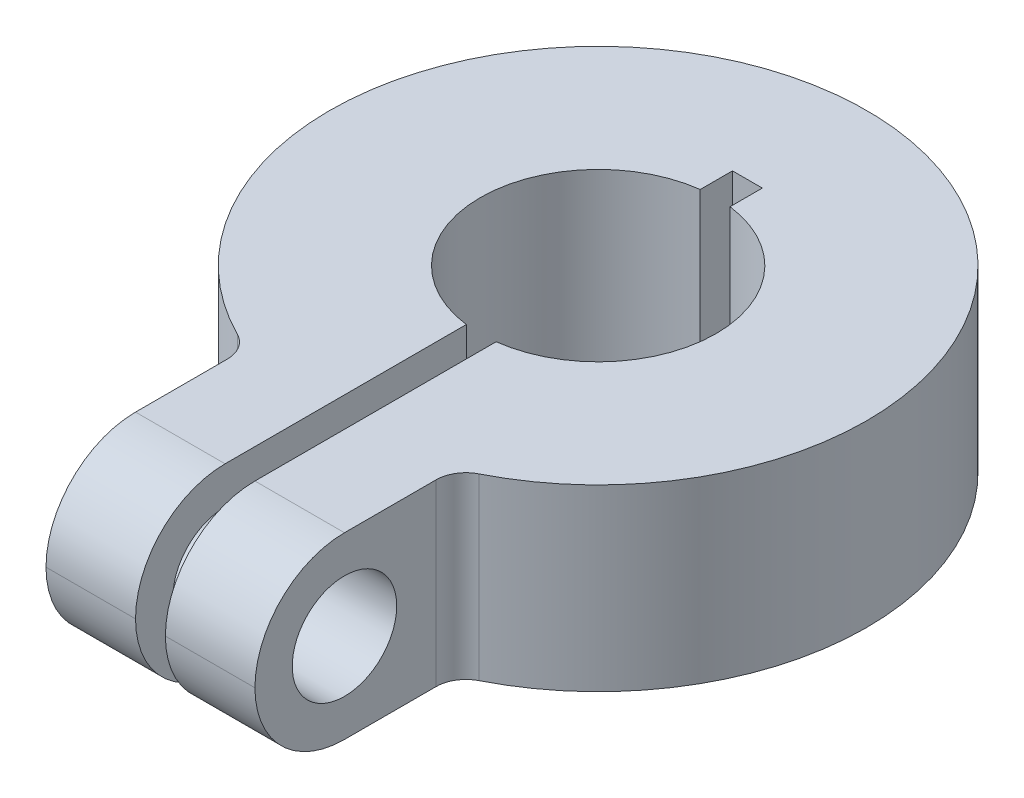
ISO-10303-21;
HEADER;
FILE_DESCRIPTION(('STEP AP214'),'2;1');
FILE_NAME('part.step','',(''),(''),'','','');
FILE_SCHEMA(('AUTOMOTIVE_DESIGN { 1 0 10303 214 1 1 1 1 }'));
ENDSEC;
DATA;
#1=APPLICATION_CONTEXT('core data for automotive mechanical design processes');
#2=APPLICATION_PROTOCOL_DEFINITION('international standard','automotive_design',2000,#1);
#3=PRODUCT_CONTEXT('',#1,'mechanical');
#4=PRODUCT('Part','Part','',(#3));
#5=PRODUCT_RELATED_PRODUCT_CATEGORY('part','',(#4));
#6=PRODUCT_DEFINITION_FORMATION('','',#4);
#7=PRODUCT_DEFINITION_CONTEXT('part definition',#1,'design');
#8=PRODUCT_DEFINITION('design','',#6,#7);
#9=PRODUCT_DEFINITION_SHAPE('','',#8);
#10=(LENGTH_UNIT() NAMED_UNIT(*) SI_UNIT(.MILLI.,.METRE.));
#11=(NAMED_UNIT(*) PLANE_ANGLE_UNIT() SI_UNIT($,.RADIAN.));
#12=(NAMED_UNIT(*) SI_UNIT($,.STERADIAN.) SOLID_ANGLE_UNIT());
#13=UNCERTAINTY_MEASURE_WITH_UNIT(LENGTH_MEASURE(1.E-05),#10,'distance_accuracy_value','');
#14=(GEOMETRIC_REPRESENTATION_CONTEXT(3) GLOBAL_UNCERTAINTY_ASSIGNED_CONTEXT((#13)) GLOBAL_UNIT_ASSIGNED_CONTEXT((#10,
#11,#12)) REPRESENTATION_CONTEXT('',''));
#15=CARTESIAN_POINT('',(0.,0.,0.));
#16=DIRECTION('',(0.,0.,1.));
#17=DIRECTION('',(1.,0.,0.));
#18=AXIS2_PLACEMENT_3D('',#15,#16,#17);
#19=CARTESIAN_POINT('',(0.,6.,0.));
#20=DIRECTION('',(0.,-1.,0.));
#21=DIRECTION('',(0.,0.,-1.));
#22=AXIS2_PLACEMENT_3D('',#19,#20,#21);
#23=CYLINDRICAL_SURFACE('',#22,3.95);
#24=DIRECTION('',(0.,-1.,0.));
#25=VECTOR('',#24,1.);
#26=CARTESIAN_POINT('',(0.500000000000001,6.,3.91822663969301));
#27=LINE('',#26,#25);
#28=CARTESIAN_POINT('',(0.500000000000001,6.,3.91822663969301));
#29=VERTEX_POINT('',#28);
#30=CARTESIAN_POINT('',(0.500000000000001,0.,3.91822663969301));
#31=VERTEX_POINT('',#30);
#32=EDGE_CURVE('E271',#29,#31,#27,.T.);
#33=ORIENTED_EDGE('',*,*,#32,.F.);
#34=CARTESIAN_POINT('',(0.,6.,0.));
#35=DIRECTION('',(0.,1.,0.));
#36=DIRECTION('',(0.,0.,1.));
#37=AXIS2_PLACEMENT_3D('',#34,#35,#36);
#38=CIRCLE('',#37,3.95);
#39=CARTESIAN_POINT('',(0.500000000000001,6.,-3.91822663969301));
#40=VERTEX_POINT('',#39);
#41=EDGE_CURVE('E262',#29,#40,#38,.T.);
#42=ORIENTED_EDGE('',*,*,#41,.T.);
#43=DIRECTION('',(0.,-1.,0.));
#44=VECTOR('',#43,1.);
#45=CARTESIAN_POINT('',(0.500000000000001,6.,-3.91822663969301));
#46=LINE('',#45,#44);
#47=CARTESIAN_POINT('',(0.500000000000001,0.,-3.91822663969301));
#48=VERTEX_POINT('',#47);
#49=EDGE_CURVE('E274',#48,#40,#46,.F.);
#50=ORIENTED_EDGE('',*,*,#49,.F.);
#51=CARTESIAN_POINT('',(0.,0.,0.));
#52=DIRECTION('',(0.,1.,0.));
#53=DIRECTION('',(0.,0.,1.));
#54=AXIS2_PLACEMENT_3D('',#51,#52,#53);
#55=CIRCLE('',#54,3.95);
#56=EDGE_CURVE('E171',#31,#48,#55,.T.);
#57=ORIENTED_EDGE('',*,*,#56,.F.);
#58=EDGE_LOOP('',(#33,#42,#50,#57));
#59=FACE_BOUND('',#58,.T.);
#60=ADVANCED_FACE('F34',(#59),#23,.F.);
#61=CARTESIAN_POINT('',(0.,6.,0.));
#62=DIRECTION('',(0.,-1.,0.));
#63=DIRECTION('',(0.,0.,-1.));
#64=AXIS2_PLACEMENT_3D('',#61,#62,#63);
#65=CYLINDRICAL_SURFACE('',#64,9.);
#66=CARTESIAN_POINT('',(0.,0.,0.));
#67=DIRECTION('',(0.,1.,0.));
#68=DIRECTION('',(0.,0.,1.));
#69=AXIS2_PLACEMENT_3D('',#66,#67,#68);
#70=CIRCLE('',#69,9.);
#71=CARTESIAN_POINT('',(4.05,0.,8.03725699477129));
#72=VERTEX_POINT('',#71);
#73=CARTESIAN_POINT('',(-4.05,0.,8.03725699477129));
#74=VERTEX_POINT('',#73);
#75=EDGE_CURVE('E250',#72,#74,#70,.T.);
#76=ORIENTED_EDGE('',*,*,#75,.T.);
#77=DIRECTION('',(0.,-1.,0.));
#78=VECTOR('',#77,1.);
#79=CARTESIAN_POINT('',(-4.05,6.,8.03725699477129));
#80=LINE('',#79,#78);
#81=CARTESIAN_POINT('',(-4.05,6.,8.03725699477129));
#82=VERTEX_POINT('',#81);
#83=EDGE_CURVE('E224',#74,#82,#80,.F.);
#84=ORIENTED_EDGE('',*,*,#83,.T.);
#85=CARTESIAN_POINT('',(0.,6.,0.));
#86=DIRECTION('',(0.,1.,0.));
#87=DIRECTION('',(0.,0.,1.));
#88=AXIS2_PLACEMENT_3D('',#85,#86,#87);
#89=CIRCLE('',#88,9.);
#90=CARTESIAN_POINT('',(4.05,6.,8.03725699477129));
#91=VERTEX_POINT('',#90);
#92=EDGE_CURVE('E238',#91,#82,#89,.T.);
#93=ORIENTED_EDGE('',*,*,#92,.F.);
#94=DIRECTION('',(0.,-1.,0.));
#95=VECTOR('',#94,1.);
#96=CARTESIAN_POINT('',(4.05,6.,8.03725699477129));
#97=LINE('',#96,#95);
#98=EDGE_CURVE('E221',#91,#72,#97,.T.);
#99=ORIENTED_EDGE('',*,*,#98,.T.);
#100=EDGE_LOOP('',(#76,#84,#93,#99));
#101=FACE_BOUND('',#100,.T.);
#102=ADVANCED_FACE('F253',(#101),#65,.T.);
#103=CARTESIAN_POINT('',(-3.5,6.,0.));
#104=DIRECTION('',(-1.,0.,0.));
#105=DIRECTION('',(0.,0.,1.));
#106=AXIS2_PLACEMENT_3D('',#103,#104,#105);
#107=PLANE('',#106);
#108=CARTESIAN_POINT('',(-3.5,3.,12.));
#109=DIRECTION('',(-1.,0.,0.));
#110=DIRECTION('',(0.,0.,1.));
#111=AXIS2_PLACEMENT_3D('',#108,#109,#110);
#112=CIRCLE('',#111,1.75);
#113=CARTESIAN_POINT('',(-3.5,3.,13.75));
#114=VERTEX_POINT('',#113);
#115=EDGE_CURVE('E213',#114,#114,#112,.T.);
#116=ORIENTED_EDGE('',*,*,#115,.F.);
#117=EDGE_LOOP('',(#116));
#118=FACE_BOUND('',#117,.T.);
#119=DIRECTION('',(0.,0.,-1.));
#120=VECTOR('',#119,1.);
#121=CARTESIAN_POINT('',(-3.5,6.,0.));
#122=LINE('',#121,#120);
#123=CARTESIAN_POINT('',(-3.5,6.,12.));
#124=VERTEX_POINT('',#123);
#125=CARTESIAN_POINT('',(-3.5,6.,8.93028554974588));
#126=VERTEX_POINT('',#125);
#127=EDGE_CURVE('E177',#124,#126,#122,.T.);
#128=ORIENTED_EDGE('',*,*,#127,.T.);
#129=DIRECTION('',(0.,-1.,0.));
#130=VECTOR('',#129,1.);
#131=CARTESIAN_POINT('',(-3.5,6.,8.93028554974588));
#132=LINE('',#131,#130);
#133=CARTESIAN_POINT('',(-3.5,0.,8.93028554974588));
#134=VERTEX_POINT('',#133);
#135=EDGE_CURVE('E206',#126,#134,#132,.T.);
#136=ORIENTED_EDGE('',*,*,#135,.T.);
#137=DIRECTION('',(0.,0.,-1.));
#138=VECTOR('',#137,1.);
#139=CARTESIAN_POINT('',(-3.5,0.,0.));
#140=LINE('',#139,#138);
#141=CARTESIAN_POINT('',(-3.5,0.,12.));
#142=VERTEX_POINT('',#141);
#143=EDGE_CURVE('E251',#142,#134,#140,.T.);
#144=ORIENTED_EDGE('',*,*,#143,.F.);
#145=CARTESIAN_POINT('',(-3.5,3.,12.));
#146=DIRECTION('',(-1.,0.,0.));
#147=DIRECTION('',(0.,0.,1.));
#148=AXIS2_PLACEMENT_3D('',#145,#146,#147);
#149=CIRCLE('',#148,3.);
#150=CARTESIAN_POINT('',(-3.5,3.,15.));
#151=VERTEX_POINT('',#150);
#152=EDGE_CURVE('E192',#142,#151,#149,.T.);
#153=ORIENTED_EDGE('',*,*,#152,.T.);
#154=CARTESIAN_POINT('',(-3.5,3.,12.));
#155=DIRECTION('',(-1.,0.,0.));
#156=DIRECTION('',(0.,0.,1.));
#157=AXIS2_PLACEMENT_3D('',#154,#155,#156);
#158=CIRCLE('',#157,3.);
#159=EDGE_CURVE('E190',#151,#124,#158,.T.);
#160=ORIENTED_EDGE('',*,*,#159,.T.);
#161=EDGE_LOOP('',(#128,#136,#144,#153,#160));
#162=FACE_BOUND('',#161,.T.);
#163=ADVANCED_FACE('F243',(#118,#162),#107,.T.);
#164=DIRECTION('',(0.,-1.,0.));
#165=VECTOR('',#164,1.);
#166=CARTESIAN_POINT('',(-0.499999999999999,6.,-3.91822663969301));
#167=LINE('',#166,#165);
#168=CARTESIAN_POINT('',(-0.499999999999999,6.,-3.91822663969301));
#169=VERTEX_POINT('',#168);
#170=CARTESIAN_POINT('',(-0.499999999999999,0.,-3.91822663969301));
#171=VERTEX_POINT('',#170);
#172=EDGE_CURVE('E276',#169,#171,#167,.T.);
#173=ORIENTED_EDGE('',*,*,#172,.F.);
#174=CARTESIAN_POINT('',(-0.499999999999999,6.,3.91822663969301));
#175=VERTEX_POINT('',#174);
#176=EDGE_CURVE('E260',#169,#175,#38,.T.);
#177=ORIENTED_EDGE('',*,*,#176,.T.);
#178=DIRECTION('',(0.,-1.,0.));
#179=VECTOR('',#178,1.);
#180=CARTESIAN_POINT('',(-0.499999999999999,6.,3.91822663969301));
#181=LINE('',#180,#179);
#182=CARTESIAN_POINT('',(-0.499999999999999,0.,3.91822663969301));
#183=VERTEX_POINT('',#182);
#184=EDGE_CURVE('E278',#183,#175,#181,.F.);
#185=ORIENTED_EDGE('',*,*,#184,.F.);
#186=EDGE_CURVE('E258',#171,#183,#55,.T.);
#187=ORIENTED_EDGE('',*,*,#186,.F.);
#188=EDGE_LOOP('',(#173,#177,#185,#187));
#189=FACE_BOUND('',#188,.T.);
#190=ADVANCED_FACE('F302',(#189),#23,.F.);
#191=CARTESIAN_POINT('',(3.5,6.,0.));
#192=DIRECTION('',(-1.,0.,0.));
#193=DIRECTION('',(0.,0.,1.));
#194=AXIS2_PLACEMENT_3D('',#191,#192,#193);
#195=PLANE('',#194);
#196=CARTESIAN_POINT('',(3.5,3.,12.));
#197=DIRECTION('',(1.,0.,0.));
#198=DIRECTION('',(0.,0.,-1.));
#199=AXIS2_PLACEMENT_3D('',#196,#197,#198);
#200=CIRCLE('',#199,1.75);
#201=CARTESIAN_POINT('',(3.5,3.,10.25));
#202=VERTEX_POINT('',#201);
#203=EDGE_CURVE('E218',#202,#202,#200,.T.);
#204=ORIENTED_EDGE('',*,*,#203,.F.);
#205=EDGE_LOOP('',(#204));
#206=FACE_BOUND('',#205,.T.);
#207=DIRECTION('',(0.,0.,-1.));
#208=VECTOR('',#207,1.);
#209=CARTESIAN_POINT('',(3.5,0.,0.));
#210=LINE('',#209,#208);
#211=CARTESIAN_POINT('',(3.5,0.,12.));
#212=VERTEX_POINT('',#211);
#213=CARTESIAN_POINT('',(3.5,0.,8.93028554974587));
#214=VERTEX_POINT('',#213);
#215=EDGE_CURVE('E256',#212,#214,#210,.T.);
#216=ORIENTED_EDGE('',*,*,#215,.T.);
#217=DIRECTION('',(0.,1.,0.));
#218=VECTOR('',#217,1.);
#219=CARTESIAN_POINT('',(3.5,6.,8.93028554974587));
#220=LINE('',#219,#218);
#221=CARTESIAN_POINT('',(3.5,6.,8.93028554974587));
#222=VERTEX_POINT('',#221);
#223=EDGE_CURVE('E49',#214,#222,#220,.T.);
#224=ORIENTED_EDGE('',*,*,#223,.T.);
#225=DIRECTION('',(0.,0.,-1.));
#226=VECTOR('',#225,1.);
#227=CARTESIAN_POINT('',(3.5,6.,0.));
#228=LINE('',#227,#226);
#229=CARTESIAN_POINT('',(3.5,6.,12.));
#230=VERTEX_POINT('',#229);
#231=EDGE_CURVE('E173',#230,#222,#228,.T.);
#232=ORIENTED_EDGE('',*,*,#231,.F.);
#233=CARTESIAN_POINT('',(3.5,3.,12.));
#234=DIRECTION('',(-1.,0.,0.));
#235=DIRECTION('',(0.,0.,1.));
#236=AXIS2_PLACEMENT_3D('',#233,#234,#235);
#237=CIRCLE('',#236,3.);
#238=CARTESIAN_POINT('',(3.5,3.,15.));
#239=VERTEX_POINT('',#238);
#240=EDGE_CURVE('E194',#230,#239,#237,.F.);
#241=ORIENTED_EDGE('',*,*,#240,.T.);
#242=CARTESIAN_POINT('',(3.5,3.,12.));
#243=DIRECTION('',(-1.,0.,0.));
#244=DIRECTION('',(0.,0.,1.));
#245=AXIS2_PLACEMENT_3D('',#242,#243,#244);
#246=CIRCLE('',#245,3.);
#247=EDGE_CURVE('E196',#239,#212,#246,.F.);
#248=ORIENTED_EDGE('',*,*,#247,.T.);
#249=EDGE_LOOP('',(#216,#224,#232,#241,#248));
#250=FACE_BOUND('',#249,.T.);
#251=ADVANCED_FACE('F300',(#206,#250),#195,.F.);
#252=CARTESIAN_POINT('',(0.,6.,0.));
#253=DIRECTION('',(0.,1.,0.));
#254=DIRECTION('',(0.,0.,1.));
#255=AXIS2_PLACEMENT_3D('',#252,#253,#254);
#256=PLANE('',#255);
#257=ORIENTED_EDGE('',*,*,#127,.F.);
#258=DIRECTION('',(1.,0.,0.));
#259=VECTOR('',#258,1.);
#260=CARTESIAN_POINT('',(-0.499999999999999,6.,12.));
#261=LINE('',#260,#259);
#262=CARTESIAN_POINT('',(-0.499999999999999,6.,12.));
#263=VERTEX_POINT('',#262);
#264=EDGE_CURVE('E204',#124,#263,#261,.T.);
#265=ORIENTED_EDGE('',*,*,#264,.T.);
#266=DIRECTION('',(0.,0.,1.));
#267=VECTOR('',#266,1.);
#268=CARTESIAN_POINT('',(-0.499999999999999,6.,15.));
#269=LINE('',#268,#267);
#270=EDGE_CURVE('E283',#175,#263,#269,.T.);
#271=ORIENTED_EDGE('',*,*,#270,.F.);
#272=ORIENTED_EDGE('',*,*,#176,.F.);
#273=CARTESIAN_POINT('',(-0.499999999999999,6.,-5.));
#274=VERTEX_POINT('',#273);
#275=EDGE_CURVE('E281',#274,#169,#269,.T.);
#276=ORIENTED_EDGE('',*,*,#275,.F.);
#277=DIRECTION('',(-1.,0.,0.));
#278=VECTOR('',#277,1.);
#279=CARTESIAN_POINT('',(-0.499999999999999,6.,-5.));
#280=LINE('',#279,#278);
#281=CARTESIAN_POINT('',(0.500000000000001,6.,-5.));
#282=VERTEX_POINT('',#281);
#283=EDGE_CURVE('E284',#282,#274,#280,.T.);
#284=ORIENTED_EDGE('',*,*,#283,.F.);
#285=DIRECTION('',(0.,0.,-1.));
#286=VECTOR('',#285,1.);
#287=CARTESIAN_POINT('',(0.500000000000001,6.,15.));
#288=LINE('',#287,#286);
#289=EDGE_CURVE('E153',#40,#282,#288,.T.);
#290=ORIENTED_EDGE('',*,*,#289,.F.);
#291=ORIENTED_EDGE('',*,*,#41,.F.);
#292=CARTESIAN_POINT('',(0.500000000000001,6.,12.));
#293=VERTEX_POINT('',#292);
#294=EDGE_CURVE('E286',#293,#29,#288,.T.);
#295=ORIENTED_EDGE('',*,*,#294,.F.);
#296=DIRECTION('',(1.,0.,0.));
#297=VECTOR('',#296,1.);
#298=CARTESIAN_POINT('',(3.5,6.,12.));
#299=LINE('',#298,#297);
#300=EDGE_CURVE('E202',#293,#230,#299,.T.);
#301=ORIENTED_EDGE('',*,*,#300,.T.);
#302=ORIENTED_EDGE('',*,*,#231,.T.);
#303=CARTESIAN_POINT('',(4.5,6.,8.93028554974587));
#304=DIRECTION('',(0.,1.,0.));
#305=DIRECTION('',(0.,0.,1.));
#306=AXIS2_PLACEMENT_3D('',#303,#304,#305);
#307=CIRCLE('',#306,1.);
#308=EDGE_CURVE('E11',#222,#91,#307,.F.);
#309=ORIENTED_EDGE('',*,*,#308,.T.);
#310=ORIENTED_EDGE('',*,*,#92,.T.);
#311=CARTESIAN_POINT('',(-4.5,6.,8.93028554974588));
#312=DIRECTION('',(0.,1.,0.));
#313=DIRECTION('',(0.,0.,1.));
#314=AXIS2_PLACEMENT_3D('',#311,#312,#313);
#315=CIRCLE('',#314,1.);
#316=EDGE_CURVE('E229',#82,#126,#315,.F.);
#317=ORIENTED_EDGE('',*,*,#316,.T.);
#318=EDGE_LOOP('',(#257,#265,#271,#272,#276,#284,#290,#291,#295,#301,#302,#309,#310,#317));
#319=FACE_BOUND('',#318,.T.);
#320=ADVANCED_FACE('F235',(#319),#256,.T.);
#321=CARTESIAN_POINT('',(0.,0.,0.));
#322=DIRECTION('',(0.,1.,0.));
#323=DIRECTION('',(0.,0.,1.));
#324=AXIS2_PLACEMENT_3D('',#321,#322,#323);
#325=PLANE('',#324);
#326=DIRECTION('',(0.,0.,1.));
#327=VECTOR('',#326,1.);
#328=CARTESIAN_POINT('',(-0.499999999999999,0.,0.));
#329=LINE('',#328,#327);
#330=CARTESIAN_POINT('',(-0.499999999999999,0.,12.));
#331=VERTEX_POINT('',#330);
#332=EDGE_CURVE('E172',#183,#331,#329,.T.);
#333=ORIENTED_EDGE('',*,*,#332,.T.);
#334=DIRECTION('',(1.,0.,0.));
#335=VECTOR('',#334,1.);
#336=CARTESIAN_POINT('',(0.,0.,12.));
#337=LINE('',#336,#335);
#338=EDGE_CURVE('E187',#331,#142,#337,.F.);
#339=ORIENTED_EDGE('',*,*,#338,.T.);
#340=ORIENTED_EDGE('',*,*,#143,.T.);
#341=CARTESIAN_POINT('',(-4.5,0.,8.93028554974588));
#342=DIRECTION('',(0.,1.,0.));
#343=DIRECTION('',(0.,0.,1.));
#344=AXIS2_PLACEMENT_3D('',#341,#342,#343);
#345=CIRCLE('',#344,1.);
#346=EDGE_CURVE('E227',#134,#74,#345,.T.);
#347=ORIENTED_EDGE('',*,*,#346,.T.);
#348=ORIENTED_EDGE('',*,*,#75,.F.);
#349=CARTESIAN_POINT('',(4.5,0.,8.93028554974587));
#350=DIRECTION('',(0.,1.,0.));
#351=DIRECTION('',(0.,0.,1.));
#352=AXIS2_PLACEMENT_3D('',#349,#350,#351);
#353=CIRCLE('',#352,1.);
#354=EDGE_CURVE('E42',#72,#214,#353,.T.);
#355=ORIENTED_EDGE('',*,*,#354,.T.);
#356=ORIENTED_EDGE('',*,*,#215,.F.);
#357=DIRECTION('',(1.,0.,0.));
#358=VECTOR('',#357,1.);
#359=CARTESIAN_POINT('',(0.,0.,12.));
#360=LINE('',#359,#358);
#361=CARTESIAN_POINT('',(0.500000000000001,0.,12.));
#362=VERTEX_POINT('',#361);
#363=EDGE_CURVE('E184',#212,#362,#360,.F.);
#364=ORIENTED_EDGE('',*,*,#363,.T.);
#365=DIRECTION('',(0.,0.,-1.));
#366=VECTOR('',#365,1.);
#367=CARTESIAN_POINT('',(0.500000000000001,0.,15.));
#368=LINE('',#367,#366);
#369=EDGE_CURVE('E165',#362,#31,#368,.T.);
#370=ORIENTED_EDGE('',*,*,#369,.T.);
#371=ORIENTED_EDGE('',*,*,#56,.T.);
#372=DIRECTION('',(0.,0.,-1.));
#373=VECTOR('',#372,1.);
#374=CARTESIAN_POINT('',(0.500000000000001,0.,0.));
#375=LINE('',#374,#373);
#376=CARTESIAN_POINT('',(0.500000000000001,0.,-5.));
#377=VERTEX_POINT('',#376);
#378=EDGE_CURVE('E150',#48,#377,#375,.T.);
#379=ORIENTED_EDGE('',*,*,#378,.T.);
#380=DIRECTION('',(-1.,0.,0.));
#381=VECTOR('',#380,1.);
#382=CARTESIAN_POINT('',(-0.499999999999999,0.,-5.));
#383=LINE('',#382,#381);
#384=CARTESIAN_POINT('',(-0.499999999999999,0.,-5.));
#385=VERTEX_POINT('',#384);
#386=EDGE_CURVE('E162',#377,#385,#383,.T.);
#387=ORIENTED_EDGE('',*,*,#386,.T.);
#388=DIRECTION('',(0.,0.,1.));
#389=VECTOR('',#388,1.);
#390=CARTESIAN_POINT('',(-0.499999999999999,0.,15.));
#391=LINE('',#390,#389);
#392=EDGE_CURVE('E158',#385,#171,#391,.T.);
#393=ORIENTED_EDGE('',*,*,#392,.T.);
#394=ORIENTED_EDGE('',*,*,#186,.T.);
#395=EDGE_LOOP('',(#333,#339,#340,#347,#348,#355,#356,#364,#370,#371,#379,#387,#393,#394));
#396=FACE_BOUND('',#395,.T.);
#397=ADVANCED_FACE('F169',(#396),#325,.F.);
#398=CARTESIAN_POINT('',(-0.499999999999999,0.,-5.));
#399=DIRECTION('',(0.,0.,-1.));
#400=DIRECTION('',(-1.,0.,0.));
#401=AXIS2_PLACEMENT_3D('',#398,#399,#400);
#402=PLANE('',#401);
#403=ORIENTED_EDGE('',*,*,#283,.T.);
#404=DIRECTION('',(0.,1.,0.));
#405=VECTOR('',#404,1.);
#406=CARTESIAN_POINT('',(-0.499999999999999,0.,-5.));
#407=LINE('',#406,#405);
#408=EDGE_CURVE('E157',#385,#274,#407,.T.);
#409=ORIENTED_EDGE('',*,*,#408,.F.);
#410=ORIENTED_EDGE('',*,*,#386,.F.);
#411=DIRECTION('',(0.,1.,0.));
#412=VECTOR('',#411,1.);
#413=CARTESIAN_POINT('',(0.500000000000001,0.,-5.));
#414=LINE('',#413,#412);
#415=EDGE_CURVE('E146',#377,#282,#414,.T.);
#416=ORIENTED_EDGE('',*,*,#415,.T.);
#417=EDGE_LOOP('',(#403,#409,#410,#416));
#418=FACE_BOUND('',#417,.T.);
#419=ADVANCED_FACE('F163',(#418),#402,.F.);
#420=CARTESIAN_POINT('',(-0.499999999999999,0.,15.));
#421=DIRECTION('',(-1.,0.,0.));
#422=DIRECTION('',(0.,0.,1.));
#423=AXIS2_PLACEMENT_3D('',#420,#421,#422);
#424=PLANE('',#423);
#425=ORIENTED_EDGE('',*,*,#172,.T.);
#426=ORIENTED_EDGE('',*,*,#392,.F.);
#427=ORIENTED_EDGE('',*,*,#408,.T.);
#428=ORIENTED_EDGE('',*,*,#275,.T.);
#429=EDGE_LOOP('',(#425,#426,#427,#428));
#430=FACE_BOUND('',#429,.T.);
#431=ADVANCED_FACE('F354',(#430),#424,.F.);
#432=CARTESIAN_POINT('',(0.500000000000001,0.,15.));
#433=DIRECTION('',(1.,0.,0.));
#434=DIRECTION('',(0.,0.,-1.));
#435=AXIS2_PLACEMENT_3D('',#432,#433,#434);
#436=PLANE('',#435);
#437=ORIENTED_EDGE('',*,*,#49,.T.);
#438=ORIENTED_EDGE('',*,*,#289,.T.);
#439=ORIENTED_EDGE('',*,*,#415,.F.);
#440=ORIENTED_EDGE('',*,*,#378,.F.);
#441=EDGE_LOOP('',(#437,#438,#439,#440));
#442=FACE_BOUND('',#441,.T.);
#443=ADVANCED_FACE('F148',(#442),#436,.F.);
#444=CARTESIAN_POINT('',(-0.499999999999999,3.,12.));
#445=DIRECTION('',(-1.,0.,0.));
#446=DIRECTION('',(0.,0.,1.));
#447=AXIS2_PLACEMENT_3D('',#444,#445,#446);
#448=CIRCLE('',#447,1.75);
#449=CARTESIAN_POINT('',(-0.499999999999999,3.,13.75));
#450=VERTEX_POINT('',#449);
#451=EDGE_CURVE('E217',#450,#450,#448,.T.);
#452=ORIENTED_EDGE('',*,*,#451,.T.);
#453=EDGE_LOOP('',(#452));
#454=FACE_BOUND('',#453,.T.);
#455=CARTESIAN_POINT('',(-0.499999999999999,3.,12.));
#456=DIRECTION('',(-1.,0.,0.));
#457=DIRECTION('',(0.,0.,1.));
#458=AXIS2_PLACEMENT_3D('',#455,#456,#457);
#459=CIRCLE('',#458,3.);
#460=CARTESIAN_POINT('',(-0.499999999999999,3.,15.));
#461=VERTEX_POINT('',#460);
#462=EDGE_CURVE('E175',#263,#461,#459,.F.);
#463=ORIENTED_EDGE('',*,*,#462,.T.);
#464=CARTESIAN_POINT('',(-0.499999999999999,3.,12.));
#465=DIRECTION('',(-1.,0.,0.));
#466=DIRECTION('',(0.,0.,1.));
#467=AXIS2_PLACEMENT_3D('',#464,#465,#466);
#468=CIRCLE('',#467,3.);
#469=EDGE_CURVE('E182',#461,#331,#468,.F.);
#470=ORIENTED_EDGE('',*,*,#469,.T.);
#471=ORIENTED_EDGE('',*,*,#332,.F.);
#472=ORIENTED_EDGE('',*,*,#184,.T.);
#473=ORIENTED_EDGE('',*,*,#270,.T.);
#474=EDGE_LOOP('',(#463,#470,#471,#472,#473));
#475=FACE_BOUND('',#474,.T.);
#476=ADVANCED_FACE('F350',(#454,#475),#424,.F.);
#477=CARTESIAN_POINT('',(0.5,3.,12.));
#478=DIRECTION('',(1.,0.,0.));
#479=DIRECTION('',(0.,0.,-1.));
#480=AXIS2_PLACEMENT_3D('',#477,#478,#479);
#481=CIRCLE('',#480,1.75);
#482=CARTESIAN_POINT('',(0.5,3.,10.25));
#483=VERTEX_POINT('',#482);
#484=EDGE_CURVE('E214',#483,#483,#481,.T.);
#485=ORIENTED_EDGE('',*,*,#484,.T.);
#486=EDGE_LOOP('',(#485));
#487=FACE_BOUND('',#486,.T.);
#488=ORIENTED_EDGE('',*,*,#369,.F.);
#489=CARTESIAN_POINT('',(0.500000000000001,3.,12.));
#490=DIRECTION('',(1.,0.,0.));
#491=DIRECTION('',(0.,0.,-1.));
#492=AXIS2_PLACEMENT_3D('',#489,#490,#491);
#493=CIRCLE('',#492,3.);
#494=CARTESIAN_POINT('',(0.500000000000001,3.,15.));
#495=VERTEX_POINT('',#494);
#496=EDGE_CURVE('E200',#362,#495,#493,.F.);
#497=ORIENTED_EDGE('',*,*,#496,.T.);
#498=CARTESIAN_POINT('',(0.500000000000001,3.,12.));
#499=DIRECTION('',(1.,0.,0.));
#500=DIRECTION('',(0.,0.,-1.));
#501=AXIS2_PLACEMENT_3D('',#498,#499,#500);
#502=CIRCLE('',#501,3.);
#503=EDGE_CURVE('E198',#495,#293,#502,.F.);
#504=ORIENTED_EDGE('',*,*,#503,.T.);
#505=ORIENTED_EDGE('',*,*,#294,.T.);
#506=ORIENTED_EDGE('',*,*,#32,.T.);
#507=EDGE_LOOP('',(#488,#497,#504,#505,#506));
#508=FACE_BOUND('',#507,.T.);
#509=ADVANCED_FACE('F328',(#487,#508),#436,.F.);
#510=CARTESIAN_POINT('',(0.,3.,12.));
#511=DIRECTION('',(-1.,0.,0.));
#512=DIRECTION('',(0.,0.,1.));
#513=AXIS2_PLACEMENT_3D('',#510,#511,#512);
#514=CYLINDRICAL_SURFACE('',#513,3.);
#515=ORIENTED_EDGE('',*,*,#264,.F.);
#516=ORIENTED_EDGE('',*,*,#159,.F.);
#517=DIRECTION('',(1.,0.,0.));
#518=VECTOR('',#517,1.);
#519=CARTESIAN_POINT('',(-3.5,3.,15.));
#520=LINE('',#519,#518);
#521=EDGE_CURVE('E207',#461,#151,#520,.F.);
#522=ORIENTED_EDGE('',*,*,#521,.F.);
#523=ORIENTED_EDGE('',*,*,#462,.F.);
#524=EDGE_LOOP('',(#515,#516,#522,#523));
#525=FACE_BOUND('',#524,.T.);
#526=ADVANCED_FACE('F324',(#525),#514,.T.);
#527=CARTESIAN_POINT('',(0.,3.,12.));
#528=DIRECTION('',(1.,0.,0.));
#529=DIRECTION('',(0.,0.,-1.));
#530=AXIS2_PLACEMENT_3D('',#527,#528,#529);
#531=CYLINDRICAL_SURFACE('',#530,3.);
#532=ORIENTED_EDGE('',*,*,#152,.F.);
#533=ORIENTED_EDGE('',*,*,#338,.F.);
#534=ORIENTED_EDGE('',*,*,#469,.F.);
#535=ORIENTED_EDGE('',*,*,#521,.T.);
#536=EDGE_LOOP('',(#532,#533,#534,#535));
#537=FACE_BOUND('',#536,.T.);
#538=ADVANCED_FACE('F320',(#537),#531,.T.);
#539=CARTESIAN_POINT('',(0.,3.,12.));
#540=DIRECTION('',(-1.,0.,0.));
#541=DIRECTION('',(0.,0.,1.));
#542=AXIS2_PLACEMENT_3D('',#539,#540,#541);
#543=CYLINDRICAL_SURFACE('',#542,3.);
#544=ORIENTED_EDGE('',*,*,#300,.F.);
#545=ORIENTED_EDGE('',*,*,#503,.F.);
#546=DIRECTION('',(1.,0.,0.));
#547=VECTOR('',#546,1.);
#548=CARTESIAN_POINT('',(0.500000000000001,3.,15.));
#549=LINE('',#548,#547);
#550=EDGE_CURVE('E210',#239,#495,#549,.F.);
#551=ORIENTED_EDGE('',*,*,#550,.F.);
#552=ORIENTED_EDGE('',*,*,#240,.F.);
#553=EDGE_LOOP('',(#544,#545,#551,#552));
#554=FACE_BOUND('',#553,.T.);
#555=ADVANCED_FACE('F323',(#554),#543,.T.);
#556=CARTESIAN_POINT('',(0.,3.,12.));
#557=DIRECTION('',(1.,0.,0.));
#558=DIRECTION('',(0.,0.,-1.));
#559=AXIS2_PLACEMENT_3D('',#556,#557,#558);
#560=CYLINDRICAL_SURFACE('',#559,3.);
#561=ORIENTED_EDGE('',*,*,#496,.F.);
#562=ORIENTED_EDGE('',*,*,#363,.F.);
#563=ORIENTED_EDGE('',*,*,#247,.F.);
#564=ORIENTED_EDGE('',*,*,#550,.T.);
#565=EDGE_LOOP('',(#561,#562,#563,#564));
#566=FACE_BOUND('',#565,.T.);
#567=ADVANCED_FACE('F330',(#566),#560,.T.);
#568=CARTESIAN_POINT('',(-9.,3.,12.));
#569=DIRECTION('',(1.,0.,0.));
#570=DIRECTION('',(0.,0.,-1.));
#571=AXIS2_PLACEMENT_3D('',#568,#569,#570);
#572=CYLINDRICAL_SURFACE('',#571,1.75);
#573=ORIENTED_EDGE('',*,*,#203,.T.);
#574=EDGE_LOOP('',(#573));
#575=FACE_BOUND('',#574,.T.);
#576=ORIENTED_EDGE('',*,*,#484,.F.);
#577=EDGE_LOOP('',(#576));
#578=FACE_BOUND('',#577,.T.);
#579=ADVANCED_FACE('F297',(#575,#578),#572,.F.);
#580=ORIENTED_EDGE('',*,*,#115,.T.);
#581=EDGE_LOOP('',(#580));
#582=FACE_BOUND('',#581,.T.);
#583=ORIENTED_EDGE('',*,*,#451,.F.);
#584=EDGE_LOOP('',(#583));
#585=FACE_BOUND('',#584,.T.);
#586=ADVANCED_FACE('F337',(#582,#585),#572,.F.);
#587=CARTESIAN_POINT('',(-4.5,6.,8.93028554974588));
#588=DIRECTION('',(0.,-1.,0.));
#589=DIRECTION('',(0.,0.,-1.));
#590=AXIS2_PLACEMENT_3D('',#587,#588,#589);
#591=CYLINDRICAL_SURFACE('',#590,1.);
#592=ORIENTED_EDGE('',*,*,#316,.F.);
#593=ORIENTED_EDGE('',*,*,#83,.F.);
#594=ORIENTED_EDGE('',*,*,#346,.F.);
#595=ORIENTED_EDGE('',*,*,#135,.F.);
#596=EDGE_LOOP('',(#592,#593,#594,#595));
#597=FACE_BOUND('',#596,.T.);
#598=ADVANCED_FACE('F248',(#597),#591,.F.);
#599=CARTESIAN_POINT('',(4.5,6.,8.93028554974587));
#600=DIRECTION('',(0.,-1.,0.));
#601=DIRECTION('',(0.,0.,-1.));
#602=AXIS2_PLACEMENT_3D('',#599,#600,#601);
#603=CYLINDRICAL_SURFACE('',#602,1.);
#604=ORIENTED_EDGE('',*,*,#308,.F.);
#605=ORIENTED_EDGE('',*,*,#223,.F.);
#606=ORIENTED_EDGE('',*,*,#354,.F.);
#607=ORIENTED_EDGE('',*,*,#98,.F.);
#608=EDGE_LOOP('',(#604,#605,#606,#607));
#609=FACE_BOUND('',#608,.T.);
#610=ADVANCED_FACE('F36',(#609),#603,.F.);
#611=CLOSED_SHELL('',(#60,#102,#163,#190,#251,#320,#397,#419,#431,#443,#476,#509,#526,#538,#555,
#567,#579,#586,#598,#610));
#612=MANIFOLD_SOLID_BREP('B2',#611);
#613=ADVANCED_BREP_SHAPE_REPRESENTATION('',(#18,#612),#14);
#614=SHAPE_DEFINITION_REPRESENTATION(#9,#613);
ENDSEC;
END-ISO-10303-21;
